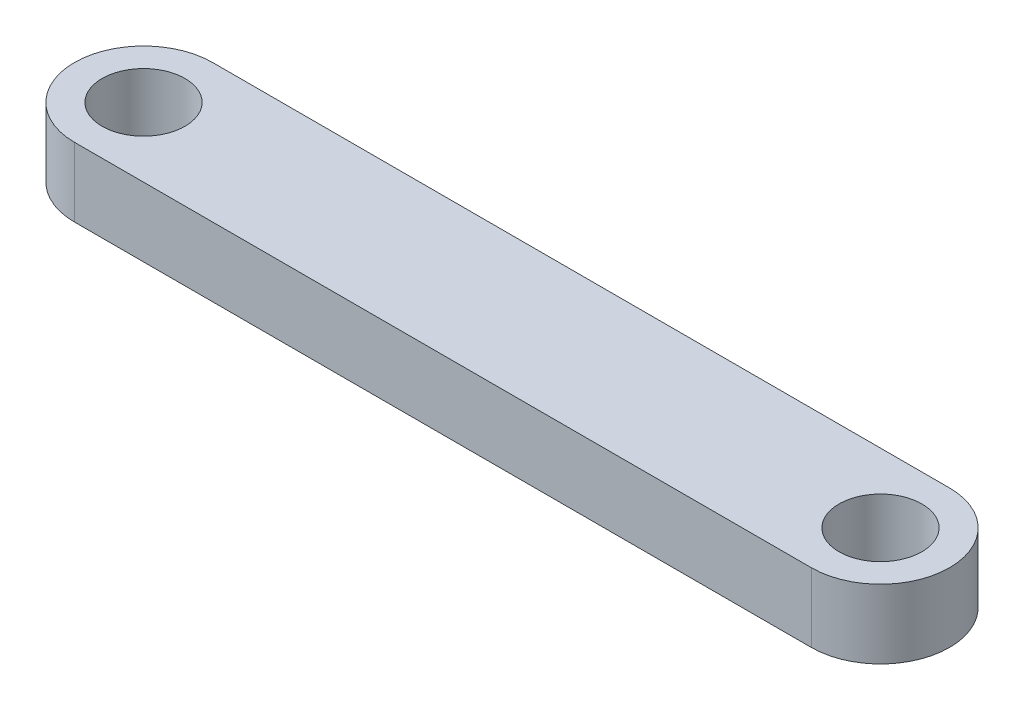
ISO-10303-21;
HEADER;
FILE_DESCRIPTION(('STEP AP214'),'2;1');
FILE_NAME('part.step','',(''),(''),'','','');
FILE_SCHEMA(('AUTOMOTIVE_DESIGN { 1 0 10303 214 1 1 1 1 }'));
ENDSEC;
DATA;
#1=APPLICATION_CONTEXT('core data for automotive mechanical design processes');
#2=APPLICATION_PROTOCOL_DEFINITION('international standard','automotive_design',2000,#1);
#3=PRODUCT_CONTEXT('',#1,'mechanical');
#4=PRODUCT('Part','Part','',(#3));
#5=PRODUCT_RELATED_PRODUCT_CATEGORY('part','',(#4));
#6=PRODUCT_DEFINITION_FORMATION('','',#4);
#7=PRODUCT_DEFINITION_CONTEXT('part definition',#1,'design');
#8=PRODUCT_DEFINITION('design','',#6,#7);
#9=PRODUCT_DEFINITION_SHAPE('','',#8);
#10=(LENGTH_UNIT() NAMED_UNIT(*) SI_UNIT(.MILLI.,.METRE.));
#11=(NAMED_UNIT(*) PLANE_ANGLE_UNIT() SI_UNIT($,.RADIAN.));
#12=(NAMED_UNIT(*) SI_UNIT($,.STERADIAN.) SOLID_ANGLE_UNIT());
#13=UNCERTAINTY_MEASURE_WITH_UNIT(LENGTH_MEASURE(1.E-05),#10,'distance_accuracy_value','');
#14=(GEOMETRIC_REPRESENTATION_CONTEXT(3) GLOBAL_UNCERTAINTY_ASSIGNED_CONTEXT((#13)) GLOBAL_UNIT_ASSIGNED_CONTEXT((#10,
#11,#12)) REPRESENTATION_CONTEXT('',''));
#15=CARTESIAN_POINT('',(0.,0.,0.));
#16=DIRECTION('',(0.,0.,1.));
#17=DIRECTION('',(1.,0.,0.));
#18=AXIS2_PLACEMENT_3D('',#15,#16,#17);
#19=CARTESIAN_POINT('',(0.,3.,0.));
#20=DIRECTION('',(0.,1.,0.));
#21=DIRECTION('',(0.,0.,1.));
#22=AXIS2_PLACEMENT_3D('',#19,#20,#21);
#23=PLANE('',#22);
#24=CARTESIAN_POINT('',(-32.,3.,0.));
#25=DIRECTION('',(0.,1.,0.));
#26=DIRECTION('',(0.,0.,1.));
#27=AXIS2_PLACEMENT_3D('',#24,#25,#26);
#28=CIRCLE('',#27,1.8);
#29=CARTESIAN_POINT('',(-32.,3.,1.8));
#30=VERTEX_POINT('',#29);
#31=EDGE_CURVE('E118',#30,#30,#28,.T.);
#32=ORIENTED_EDGE('',*,*,#31,.F.);
#33=EDGE_LOOP('',(#32));
#34=FACE_BOUND('',#33,.T.);
#35=CARTESIAN_POINT('',(0.,3.,0.));
#36=DIRECTION('',(0.,1.,0.));
#37=DIRECTION('',(0.,0.,1.));
#38=AXIS2_PLACEMENT_3D('',#35,#36,#37);
#39=CIRCLE('',#38,3.);
#40=CARTESIAN_POINT('',(0.,3.,3.));
#41=VERTEX_POINT('',#40);
#42=CARTESIAN_POINT('',(0.,3.,-3.));
#43=VERTEX_POINT('',#42);
#44=EDGE_CURVE('E98',#41,#43,#39,.T.);
#45=ORIENTED_EDGE('',*,*,#44,.T.);
#46=DIRECTION('',(-1.,0.,0.));
#47=VECTOR('',#46,1.);
#48=CARTESIAN_POINT('',(0.,3.,-3.));
#49=LINE('',#48,#47);
#50=CARTESIAN_POINT('',(-32.,3.,-3.));
#51=VERTEX_POINT('',#50);
#52=EDGE_CURVE('E93',#43,#51,#49,.T.);
#53=ORIENTED_EDGE('',*,*,#52,.T.);
#54=CARTESIAN_POINT('',(-32.,3.,0.));
#55=DIRECTION('',(0.,1.,0.));
#56=DIRECTION('',(0.,0.,1.));
#57=AXIS2_PLACEMENT_3D('',#54,#55,#56);
#58=CIRCLE('',#57,3.);
#59=CARTESIAN_POINT('',(-32.,3.,3.));
#60=VERTEX_POINT('',#59);
#61=EDGE_CURVE('E96',#51,#60,#58,.T.);
#62=ORIENTED_EDGE('',*,*,#61,.T.);
#63=DIRECTION('',(1.,0.,0.));
#64=VECTOR('',#63,1.);
#65=CARTESIAN_POINT('',(0.,3.,3.));
#66=LINE('',#65,#64);
#67=EDGE_CURVE('E63',#60,#41,#66,.T.);
#68=ORIENTED_EDGE('',*,*,#67,.T.);
#69=EDGE_LOOP('',(#45,#53,#62,#68));
#70=FACE_BOUND('',#69,.T.);
#71=CARTESIAN_POINT('',(0.,3.,0.));
#72=DIRECTION('',(0.,1.,0.));
#73=DIRECTION('',(0.,0.,1.));
#74=AXIS2_PLACEMENT_3D('',#71,#72,#73);
#75=CIRCLE('',#74,1.8);
#76=CARTESIAN_POINT('',(0.,3.,1.8));
#77=VERTEX_POINT('',#76);
#78=EDGE_CURVE('E140',#77,#77,#75,.T.);
#79=ORIENTED_EDGE('',*,*,#78,.F.);
#80=EDGE_LOOP('',(#79));
#81=FACE_BOUND('',#80,.T.);
#82=ADVANCED_FACE('F45',(#34,#70,#81),#23,.T.);
#83=CARTESIAN_POINT('',(0.,0.,0.));
#84=DIRECTION('',(0.,1.,0.));
#85=DIRECTION('',(0.,0.,1.));
#86=AXIS2_PLACEMENT_3D('',#83,#84,#85);
#87=PLANE('',#86);
#88=CARTESIAN_POINT('',(0.,0.,0.));
#89=DIRECTION('',(0.,1.,0.));
#90=DIRECTION('',(0.,0.,1.));
#91=AXIS2_PLACEMENT_3D('',#88,#89,#90);
#92=CIRCLE('',#91,3.);
#93=CARTESIAN_POINT('',(0.,0.,3.));
#94=VERTEX_POINT('',#93);
#95=CARTESIAN_POINT('',(0.,0.,-3.));
#96=VERTEX_POINT('',#95);
#97=EDGE_CURVE('E114',#94,#96,#92,.T.);
#98=ORIENTED_EDGE('',*,*,#97,.F.);
#99=DIRECTION('',(1.,0.,0.));
#100=VECTOR('',#99,1.);
#101=CARTESIAN_POINT('',(0.,0.,3.));
#102=LINE('',#101,#100);
#103=CARTESIAN_POINT('',(-32.,0.,3.));
#104=VERTEX_POINT('',#103);
#105=EDGE_CURVE('E86',#104,#94,#102,.T.);
#106=ORIENTED_EDGE('',*,*,#105,.F.);
#107=CARTESIAN_POINT('',(-32.,0.,0.));
#108=DIRECTION('',(0.,1.,0.));
#109=DIRECTION('',(0.,0.,1.));
#110=AXIS2_PLACEMENT_3D('',#107,#108,#109);
#111=CIRCLE('',#110,3.);
#112=CARTESIAN_POINT('',(-32.,0.,-3.));
#113=VERTEX_POINT('',#112);
#114=EDGE_CURVE('E80',#113,#104,#111,.T.);
#115=ORIENTED_EDGE('',*,*,#114,.F.);
#116=DIRECTION('',(-1.,0.,0.));
#117=VECTOR('',#116,1.);
#118=CARTESIAN_POINT('',(0.,0.,-3.));
#119=LINE('',#118,#117);
#120=EDGE_CURVE('E103',#96,#113,#119,.T.);
#121=ORIENTED_EDGE('',*,*,#120,.F.);
#122=EDGE_LOOP('',(#98,#106,#115,#121));
#123=FACE_BOUND('',#122,.T.);
#124=CARTESIAN_POINT('',(-32.,0.,0.));
#125=DIRECTION('',(0.,1.,0.));
#126=DIRECTION('',(0.,0.,1.));
#127=AXIS2_PLACEMENT_3D('',#124,#125,#126);
#128=CIRCLE('',#127,1.8);
#129=CARTESIAN_POINT('',(-32.,0.,1.8));
#130=VERTEX_POINT('',#129);
#131=EDGE_CURVE('E136',#130,#130,#128,.T.);
#132=ORIENTED_EDGE('',*,*,#131,.T.);
#133=EDGE_LOOP('',(#132));
#134=FACE_BOUND('',#133,.T.);
#135=CARTESIAN_POINT('',(0.,0.,0.));
#136=DIRECTION('',(0.,1.,0.));
#137=DIRECTION('',(0.,0.,1.));
#138=AXIS2_PLACEMENT_3D('',#135,#136,#137);
#139=CIRCLE('',#138,1.8);
#140=CARTESIAN_POINT('',(0.,0.,1.8));
#141=VERTEX_POINT('',#140);
#142=EDGE_CURVE('E144',#141,#141,#139,.T.);
#143=ORIENTED_EDGE('',*,*,#142,.T.);
#144=EDGE_LOOP('',(#143));
#145=FACE_BOUND('',#144,.T.);
#146=ADVANCED_FACE('F131',(#123,#134,#145),#87,.F.);
#147=CARTESIAN_POINT('',(0.,3.,0.));
#148=DIRECTION('',(0.,-1.,0.));
#149=DIRECTION('',(0.,0.,-1.));
#150=AXIS2_PLACEMENT_3D('',#147,#148,#149);
#151=CYLINDRICAL_SURFACE('',#150,3.);
#152=ORIENTED_EDGE('',*,*,#97,.T.);
#153=DIRECTION('',(0.,-1.,0.));
#154=VECTOR('',#153,1.);
#155=CARTESIAN_POINT('',(0.,3.,-3.));
#156=LINE('',#155,#154);
#157=EDGE_CURVE('E11',#43,#96,#156,.T.);
#158=ORIENTED_EDGE('',*,*,#157,.F.);
#159=ORIENTED_EDGE('',*,*,#44,.F.);
#160=DIRECTION('',(0.,-1.,0.));
#161=VECTOR('',#160,1.);
#162=CARTESIAN_POINT('',(0.,3.,3.));
#163=LINE('',#162,#161);
#164=EDGE_CURVE('E110',#41,#94,#163,.T.);
#165=ORIENTED_EDGE('',*,*,#164,.T.);
#166=EDGE_LOOP('',(#152,#158,#159,#165));
#167=FACE_BOUND('',#166,.T.);
#168=ADVANCED_FACE('F47',(#167),#151,.T.);
#169=CARTESIAN_POINT('',(0.,3.,-3.));
#170=DIRECTION('',(0.,0.,1.));
#171=DIRECTION('',(1.,0.,0.));
#172=AXIS2_PLACEMENT_3D('',#169,#170,#171);
#173=PLANE('',#172);
#174=ORIENTED_EDGE('',*,*,#120,.T.);
#175=DIRECTION('',(0.,-1.,0.));
#176=VECTOR('',#175,1.);
#177=CARTESIAN_POINT('',(-32.,3.,-3.));
#178=LINE('',#177,#176);
#179=EDGE_CURVE('E55',#51,#113,#178,.T.);
#180=ORIENTED_EDGE('',*,*,#179,.F.);
#181=ORIENTED_EDGE('',*,*,#52,.F.);
#182=ORIENTED_EDGE('',*,*,#157,.T.);
#183=EDGE_LOOP('',(#174,#180,#181,#182));
#184=FACE_BOUND('',#183,.T.);
#185=ADVANCED_FACE('F102',(#184),#173,.F.);
#186=CARTESIAN_POINT('',(-32.,3.,0.));
#187=DIRECTION('',(0.,-1.,0.));
#188=DIRECTION('',(0.,0.,-1.));
#189=AXIS2_PLACEMENT_3D('',#186,#187,#188);
#190=CYLINDRICAL_SURFACE('',#189,3.);
#191=ORIENTED_EDGE('',*,*,#114,.T.);
#192=DIRECTION('',(0.,-1.,0.));
#193=VECTOR('',#192,1.);
#194=CARTESIAN_POINT('',(-32.,3.,3.));
#195=LINE('',#194,#193);
#196=EDGE_CURVE('E105',#60,#104,#195,.T.);
#197=ORIENTED_EDGE('',*,*,#196,.F.);
#198=ORIENTED_EDGE('',*,*,#61,.F.);
#199=ORIENTED_EDGE('',*,*,#179,.T.);
#200=EDGE_LOOP('',(#191,#197,#198,#199));
#201=FACE_BOUND('',#200,.T.);
#202=ADVANCED_FACE('F106',(#201),#190,.T.);
#203=CARTESIAN_POINT('',(0.,3.,3.));
#204=DIRECTION('',(0.,0.,-1.));
#205=DIRECTION('',(-1.,0.,0.));
#206=AXIS2_PLACEMENT_3D('',#203,#204,#205);
#207=PLANE('',#206);
#208=ORIENTED_EDGE('',*,*,#105,.T.);
#209=ORIENTED_EDGE('',*,*,#164,.F.);
#210=ORIENTED_EDGE('',*,*,#67,.F.);
#211=ORIENTED_EDGE('',*,*,#196,.T.);
#212=EDGE_LOOP('',(#208,#209,#210,#211));
#213=FACE_BOUND('',#212,.T.);
#214=ADVANCED_FACE('F128',(#213),#207,.F.);
#215=CARTESIAN_POINT('',(-32.,3.,0.));
#216=DIRECTION('',(0.,-1.,0.));
#217=DIRECTION('',(0.,0.,-1.));
#218=AXIS2_PLACEMENT_3D('',#215,#216,#217);
#219=CYLINDRICAL_SURFACE('',#218,1.8);
#220=ORIENTED_EDGE('',*,*,#31,.T.);
#221=EDGE_LOOP('',(#220));
#222=FACE_BOUND('',#221,.T.);
#223=ORIENTED_EDGE('',*,*,#131,.F.);
#224=EDGE_LOOP('',(#223));
#225=FACE_BOUND('',#224,.T.);
#226=ADVANCED_FACE('F163',(#222,#225),#219,.F.);
#227=CARTESIAN_POINT('',(0.,3.,0.));
#228=DIRECTION('',(0.,-1.,0.));
#229=DIRECTION('',(0.,0.,-1.));
#230=AXIS2_PLACEMENT_3D('',#227,#228,#229);
#231=CYLINDRICAL_SURFACE('',#230,1.8);
#232=ORIENTED_EDGE('',*,*,#78,.T.);
#233=EDGE_LOOP('',(#232));
#234=FACE_BOUND('',#233,.T.);
#235=ORIENTED_EDGE('',*,*,#142,.F.);
#236=EDGE_LOOP('',(#235));
#237=FACE_BOUND('',#236,.T.);
#238=ADVANCED_FACE('F152',(#234,#237),#231,.F.);
#239=CLOSED_SHELL('',(#82,#146,#168,#185,#202,#214,#226,#238));
#240=MANIFOLD_SOLID_BREP('B2',#239);
#241=ADVANCED_BREP_SHAPE_REPRESENTATION('',(#18,#240),#14);
#242=SHAPE_DEFINITION_REPRESENTATION(#9,#241);
ENDSEC;
END-ISO-10303-21;
